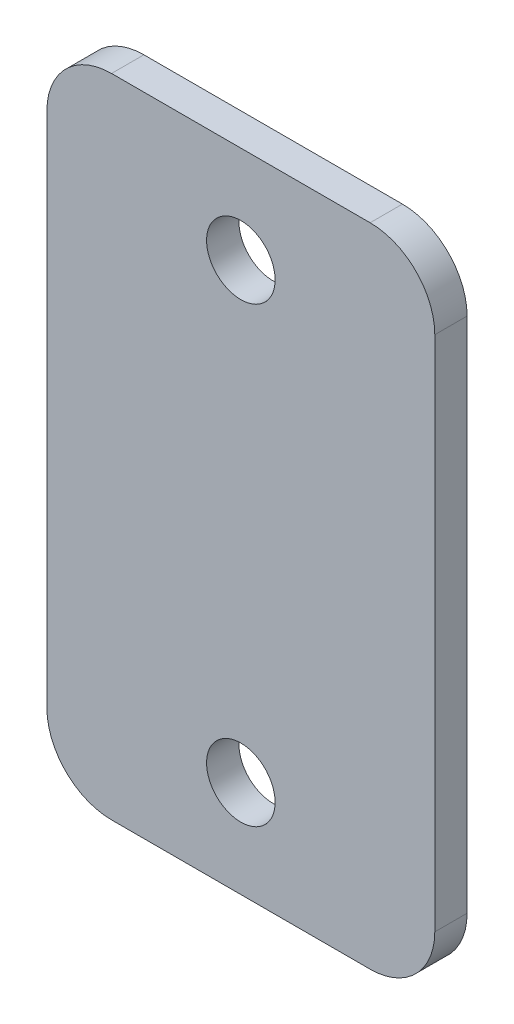
ISO-10303-21;
HEADER;
FILE_DESCRIPTION(('STEP AP214'),'2;1');
FILE_NAME('part.step','',(''),(''),'','','');
FILE_SCHEMA(('AUTOMOTIVE_DESIGN { 1 0 10303 214 1 1 1 1 }'));
ENDSEC;
DATA;
#1=APPLICATION_CONTEXT('core data for automotive mechanical design processes');
#2=APPLICATION_PROTOCOL_DEFINITION('international standard','automotive_design',2000,#1);
#3=PRODUCT_CONTEXT('',#1,'mechanical');
#4=PRODUCT('Part','Part','',(#3));
#5=PRODUCT_RELATED_PRODUCT_CATEGORY('part','',(#4));
#6=PRODUCT_DEFINITION_FORMATION('','',#4);
#7=PRODUCT_DEFINITION_CONTEXT('part definition',#1,'design');
#8=PRODUCT_DEFINITION('design','',#6,#7);
#9=PRODUCT_DEFINITION_SHAPE('','',#8);
#10=(LENGTH_UNIT() NAMED_UNIT(*) SI_UNIT(.MILLI.,.METRE.));
#11=(NAMED_UNIT(*) PLANE_ANGLE_UNIT() SI_UNIT($,.RADIAN.));
#12=(NAMED_UNIT(*) SI_UNIT($,.STERADIAN.) SOLID_ANGLE_UNIT());
#13=UNCERTAINTY_MEASURE_WITH_UNIT(LENGTH_MEASURE(1.E-05),#10,'distance_accuracy_value','');
#14=(GEOMETRIC_REPRESENTATION_CONTEXT(3) GLOBAL_UNCERTAINTY_ASSIGNED_CONTEXT((#13)) GLOBAL_UNIT_ASSIGNED_CONTEXT((#10,
#11,#12)) REPRESENTATION_CONTEXT('',''));
#15=CARTESIAN_POINT('',(0.,0.,0.));
#16=DIRECTION('',(0.,0.,1.));
#17=DIRECTION('',(1.,0.,0.));
#18=AXIS2_PLACEMENT_3D('',#15,#16,#17);
#19=CARTESIAN_POINT('',(0.,0.,0.));
#20=DIRECTION('',(0.,0.,1.));
#21=DIRECTION('',(1.,0.,0.));
#22=AXIS2_PLACEMENT_3D('',#19,#20,#21);
#23=PLANE('',#22);
#24=CARTESIAN_POINT('',(19.05,9.525,0.));
#25=DIRECTION('',(0.,0.,1.));
#26=DIRECTION('',(1.,0.,0.));
#27=AXIS2_PLACEMENT_3D('',#24,#25,#26);
#28=CIRCLE('',#27,3.3655);
#29=CARTESIAN_POINT('',(22.4155,9.525,0.));
#30=VERTEX_POINT('',#29);
#31=EDGE_CURVE('E133',#30,#30,#28,.T.);
#32=ORIENTED_EDGE('',*,*,#31,.T.);
#33=EDGE_LOOP('',(#32));
#34=FACE_BOUND('',#33,.T.);
#35=CARTESIAN_POINT('',(19.05,53.975,0.));
#36=DIRECTION('',(0.,0.,1.));
#37=DIRECTION('',(1.,0.,0.));
#38=AXIS2_PLACEMENT_3D('',#35,#36,#37);
#39=CIRCLE('',#38,3.3655);
#40=CARTESIAN_POINT('',(22.4155,53.975,0.));
#41=VERTEX_POINT('',#40);
#42=EDGE_CURVE('E136',#41,#41,#39,.T.);
#43=ORIENTED_EDGE('',*,*,#42,.T.);
#44=EDGE_LOOP('',(#43));
#45=FACE_BOUND('',#44,.T.);
#46=CARTESIAN_POINT('',(31.75,57.15,0.));
#47=DIRECTION('',(0.,0.,-1.));
#48=DIRECTION('',(-1.,0.,0.));
#49=AXIS2_PLACEMENT_3D('',#46,#47,#48);
#50=CIRCLE('',#49,6.35);
#51=CARTESIAN_POINT('',(38.1,57.15,0.));
#52=VERTEX_POINT('',#51);
#53=CARTESIAN_POINT('',(31.75,63.5,0.));
#54=VERTEX_POINT('',#53);
#55=EDGE_CURVE('E142',#52,#54,#50,.F.);
#56=ORIENTED_EDGE('',*,*,#55,.F.);
#57=DIRECTION('',(0.,1.,0.));
#58=VECTOR('',#57,1.);
#59=CARTESIAN_POINT('',(38.1,0.,0.));
#60=LINE('',#59,#58);
#61=CARTESIAN_POINT('',(38.1,6.35,0.));
#62=VERTEX_POINT('',#61);
#63=EDGE_CURVE('E113',#62,#52,#60,.T.);
#64=ORIENTED_EDGE('',*,*,#63,.F.);
#65=CARTESIAN_POINT('',(31.75,6.35,0.));
#66=DIRECTION('',(0.,0.,-1.));
#67=DIRECTION('',(-1.,0.,0.));
#68=AXIS2_PLACEMENT_3D('',#65,#66,#67);
#69=CIRCLE('',#68,6.35);
#70=CARTESIAN_POINT('',(31.75,0.,0.));
#71=VERTEX_POINT('',#70);
#72=EDGE_CURVE('E94',#71,#62,#69,.F.);
#73=ORIENTED_EDGE('',*,*,#72,.F.);
#74=DIRECTION('',(1.,0.,0.));
#75=VECTOR('',#74,1.);
#76=CARTESIAN_POINT('',(0.,0.,0.));
#77=LINE('',#76,#75);
#78=CARTESIAN_POINT('',(6.35,0.,0.));
#79=VERTEX_POINT('',#78);
#80=EDGE_CURVE('E91',#79,#71,#77,.T.);
#81=ORIENTED_EDGE('',*,*,#80,.F.);
#82=CARTESIAN_POINT('',(6.35,6.35,0.));
#83=DIRECTION('',(0.,0.,-1.));
#84=DIRECTION('',(-1.,0.,0.));
#85=AXIS2_PLACEMENT_3D('',#82,#83,#84);
#86=CIRCLE('',#85,6.35);
#87=CARTESIAN_POINT('',(0.,6.35,0.));
#88=VERTEX_POINT('',#87);
#89=EDGE_CURVE('E19',#88,#79,#86,.F.);
#90=ORIENTED_EDGE('',*,*,#89,.F.);
#91=DIRECTION('',(0.,1.,0.));
#92=VECTOR('',#91,1.);
#93=CARTESIAN_POINT('',(0.,63.5,0.));
#94=LINE('',#93,#92);
#95=CARTESIAN_POINT('',(0.,57.15,0.));
#96=VERTEX_POINT('',#95);
#97=EDGE_CURVE('E77',#96,#88,#94,.F.);
#98=ORIENTED_EDGE('',*,*,#97,.F.);
#99=CARTESIAN_POINT('',(6.35,57.15,0.));
#100=DIRECTION('',(0.,0.,-1.));
#101=DIRECTION('',(-1.,0.,0.));
#102=AXIS2_PLACEMENT_3D('',#99,#100,#101);
#103=CIRCLE('',#102,6.35);
#104=CARTESIAN_POINT('',(6.35,63.5,0.));
#105=VERTEX_POINT('',#104);
#106=EDGE_CURVE('E139',#105,#96,#103,.F.);
#107=ORIENTED_EDGE('',*,*,#106,.F.);
#108=DIRECTION('',(1.,0.,0.));
#109=VECTOR('',#108,1.);
#110=CARTESIAN_POINT('',(38.1,63.5,0.));
#111=LINE('',#110,#109);
#112=EDGE_CURVE('E108',#54,#105,#111,.F.);
#113=ORIENTED_EDGE('',*,*,#112,.F.);
#114=EDGE_LOOP('',(#56,#64,#73,#81,#90,#98,#107,#113));
#115=FACE_BOUND('',#114,.T.);
#116=ADVANCED_FACE('F16',(#34,#45,#115),#23,.F.);
#117=CARTESIAN_POINT('',(0.,63.5,0.));
#118=DIRECTION('',(-1.,0.,0.));
#119=DIRECTION('',(0.,0.,1.));
#120=AXIS2_PLACEMENT_3D('',#117,#118,#119);
#121=PLANE('',#120);
#122=DIRECTION('',(0.,1.,0.));
#123=VECTOR('',#122,1.);
#124=CARTESIAN_POINT('',(0.,0.,3.175));
#125=LINE('',#124,#123);
#126=CARTESIAN_POINT('',(0.,57.15,3.175));
#127=VERTEX_POINT('',#126);
#128=CARTESIAN_POINT('',(0.,6.35,3.175));
#129=VERTEX_POINT('',#128);
#130=EDGE_CURVE('E132',#127,#129,#125,.F.);
#131=ORIENTED_EDGE('',*,*,#130,.F.);
#132=DIRECTION('',(0.,0.,-1.));
#133=VECTOR('',#132,1.);
#134=CARTESIAN_POINT('',(0.,57.15,11.13155));
#135=LINE('',#134,#133);
#136=EDGE_CURVE('E110',#96,#127,#135,.F.);
#137=ORIENTED_EDGE('',*,*,#136,.F.);
#138=ORIENTED_EDGE('',*,*,#97,.T.);
#139=DIRECTION('',(0.,0.,-1.));
#140=VECTOR('',#139,1.);
#141=CARTESIAN_POINT('',(0.,6.35,11.13155));
#142=LINE('',#141,#140);
#143=EDGE_CURVE('E88',#129,#88,#142,.T.);
#144=ORIENTED_EDGE('',*,*,#143,.F.);
#145=EDGE_LOOP('',(#131,#137,#138,#144));
#146=FACE_BOUND('',#145,.T.);
#147=ADVANCED_FACE('F174',(#146),#121,.T.);
#148=CARTESIAN_POINT('',(6.35,6.35,11.13155));
#149=DIRECTION('',(0.,0.,-1.));
#150=DIRECTION('',(-1.,0.,0.));
#151=AXIS2_PLACEMENT_3D('',#148,#149,#150);
#152=CYLINDRICAL_SURFACE('',#151,6.35);
#153=ORIENTED_EDGE('',*,*,#143,.T.);
#154=ORIENTED_EDGE('',*,*,#89,.T.);
#155=DIRECTION('',(0.,0.,-1.));
#156=VECTOR('',#155,1.);
#157=CARTESIAN_POINT('',(6.35,0.,0.));
#158=LINE('',#157,#156);
#159=CARTESIAN_POINT('',(6.35,0.,3.175));
#160=VERTEX_POINT('',#159);
#161=EDGE_CURVE('E86',#160,#79,#158,.T.);
#162=ORIENTED_EDGE('',*,*,#161,.F.);
#163=CARTESIAN_POINT('',(6.35,6.35,3.175));
#164=DIRECTION('',(0.,0.,-1.));
#165=DIRECTION('',(-1.,0.,0.));
#166=AXIS2_PLACEMENT_3D('',#163,#164,#165);
#167=CIRCLE('',#166,6.35);
#168=EDGE_CURVE('E130',#129,#160,#167,.F.);
#169=ORIENTED_EDGE('',*,*,#168,.F.);
#170=EDGE_LOOP('',(#153,#154,#162,#169));
#171=FACE_BOUND('',#170,.T.);
#172=ADVANCED_FACE('F83',(#171),#152,.T.);
#173=CARTESIAN_POINT('',(0.,0.,0.));
#174=DIRECTION('',(0.,-1.,0.));
#175=DIRECTION('',(0.,0.,-1.));
#176=AXIS2_PLACEMENT_3D('',#173,#174,#175);
#177=PLANE('',#176);
#178=ORIENTED_EDGE('',*,*,#80,.T.);
#179=DIRECTION('',(0.,0.,-1.));
#180=VECTOR('',#179,1.);
#181=CARTESIAN_POINT('',(31.75,0.,11.13155));
#182=LINE('',#181,#180);
#183=CARTESIAN_POINT('',(31.75,0.,3.175));
#184=VERTEX_POINT('',#183);
#185=EDGE_CURVE('E97',#184,#71,#182,.T.);
#186=ORIENTED_EDGE('',*,*,#185,.F.);
#187=DIRECTION('',(1.,0.,0.));
#188=VECTOR('',#187,1.);
#189=CARTESIAN_POINT('',(0.,0.,3.175));
#190=LINE('',#189,#188);
#191=EDGE_CURVE('E101',#160,#184,#190,.T.);
#192=ORIENTED_EDGE('',*,*,#191,.F.);
#193=ORIENTED_EDGE('',*,*,#161,.T.);
#194=EDGE_LOOP('',(#178,#186,#192,#193));
#195=FACE_BOUND('',#194,.T.);
#196=ADVANCED_FACE('F99',(#195),#177,.T.);
#197=CARTESIAN_POINT('',(31.75,6.35,11.13155));
#198=DIRECTION('',(0.,0.,-1.));
#199=DIRECTION('',(-1.,0.,0.));
#200=AXIS2_PLACEMENT_3D('',#197,#198,#199);
#201=CYLINDRICAL_SURFACE('',#200,6.35);
#202=ORIENTED_EDGE('',*,*,#185,.T.);
#203=ORIENTED_EDGE('',*,*,#72,.T.);
#204=DIRECTION('',(0.,0.,-1.));
#205=VECTOR('',#204,1.);
#206=CARTESIAN_POINT('',(38.1,6.35,0.));
#207=LINE('',#206,#205);
#208=CARTESIAN_POINT('',(38.1,6.35,3.175));
#209=VERTEX_POINT('',#208);
#210=EDGE_CURVE('E115',#209,#62,#207,.T.);
#211=ORIENTED_EDGE('',*,*,#210,.F.);
#212=CARTESIAN_POINT('',(31.75,6.35,3.175));
#213=DIRECTION('',(0.,0.,-1.));
#214=DIRECTION('',(-1.,0.,0.));
#215=AXIS2_PLACEMENT_3D('',#212,#213,#214);
#216=CIRCLE('',#215,6.35);
#217=EDGE_CURVE('E127',#184,#209,#216,.F.);
#218=ORIENTED_EDGE('',*,*,#217,.F.);
#219=EDGE_LOOP('',(#202,#203,#211,#218));
#220=FACE_BOUND('',#219,.T.);
#221=ADVANCED_FACE('F146',(#220),#201,.T.);
#222=CARTESIAN_POINT('',(38.1,0.,0.));
#223=DIRECTION('',(1.,0.,0.));
#224=DIRECTION('',(0.,0.,-1.));
#225=AXIS2_PLACEMENT_3D('',#222,#223,#224);
#226=PLANE('',#225);
#227=ORIENTED_EDGE('',*,*,#63,.T.);
#228=DIRECTION('',(0.,0.,-1.));
#229=VECTOR('',#228,1.);
#230=CARTESIAN_POINT('',(38.1,57.15,11.13155));
#231=LINE('',#230,#229);
#232=CARTESIAN_POINT('',(38.1,57.15,3.175));
#233=VERTEX_POINT('',#232);
#234=EDGE_CURVE('E114',#233,#52,#231,.T.);
#235=ORIENTED_EDGE('',*,*,#234,.F.);
#236=DIRECTION('',(0.,1.,0.));
#237=VECTOR('',#236,1.);
#238=CARTESIAN_POINT('',(38.1,0.,3.175));
#239=LINE('',#238,#237);
#240=EDGE_CURVE('E126',#209,#233,#239,.T.);
#241=ORIENTED_EDGE('',*,*,#240,.F.);
#242=ORIENTED_EDGE('',*,*,#210,.T.);
#243=EDGE_LOOP('',(#227,#235,#241,#242));
#244=FACE_BOUND('',#243,.T.);
#245=ADVANCED_FACE('F169',(#244),#226,.T.);
#246=CARTESIAN_POINT('',(31.75,57.15,11.13155));
#247=DIRECTION('',(0.,0.,-1.));
#248=DIRECTION('',(-1.,0.,0.));
#249=AXIS2_PLACEMENT_3D('',#246,#247,#248);
#250=CYLINDRICAL_SURFACE('',#249,6.35);
#251=ORIENTED_EDGE('',*,*,#234,.T.);
#252=ORIENTED_EDGE('',*,*,#55,.T.);
#253=DIRECTION('',(0.,0.,1.));
#254=VECTOR('',#253,1.);
#255=CARTESIAN_POINT('',(31.75,63.5,0.));
#256=LINE('',#255,#254);
#257=CARTESIAN_POINT('',(31.75,63.5,3.175));
#258=VERTEX_POINT('',#257);
#259=EDGE_CURVE('E111',#258,#54,#256,.F.);
#260=ORIENTED_EDGE('',*,*,#259,.F.);
#261=CARTESIAN_POINT('',(31.75,57.15,3.175));
#262=DIRECTION('',(0.,0.,-1.));
#263=DIRECTION('',(-1.,0.,0.));
#264=AXIS2_PLACEMENT_3D('',#261,#262,#263);
#265=CIRCLE('',#264,6.35);
#266=EDGE_CURVE('E123',#233,#258,#265,.F.);
#267=ORIENTED_EDGE('',*,*,#266,.F.);
#268=EDGE_LOOP('',(#251,#252,#260,#267));
#269=FACE_BOUND('',#268,.T.);
#270=ADVANCED_FACE('F166',(#269),#250,.T.);
#271=CARTESIAN_POINT('',(38.1,63.5,0.));
#272=DIRECTION('',(0.,1.,0.));
#273=DIRECTION('',(0.,0.,1.));
#274=AXIS2_PLACEMENT_3D('',#271,#272,#273);
#275=PLANE('',#274);
#276=ORIENTED_EDGE('',*,*,#112,.T.);
#277=DIRECTION('',(0.,0.,-1.));
#278=VECTOR('',#277,1.);
#279=CARTESIAN_POINT('',(6.35,63.5,11.13155));
#280=LINE('',#279,#278);
#281=CARTESIAN_POINT('',(6.35,63.5,3.175));
#282=VERTEX_POINT('',#281);
#283=EDGE_CURVE('E34',#282,#105,#280,.T.);
#284=ORIENTED_EDGE('',*,*,#283,.F.);
#285=DIRECTION('',(1.,0.,0.));
#286=VECTOR('',#285,1.);
#287=CARTESIAN_POINT('',(0.,63.5,3.175));
#288=LINE('',#287,#286);
#289=EDGE_CURVE('E122',#258,#282,#288,.F.);
#290=ORIENTED_EDGE('',*,*,#289,.F.);
#291=ORIENTED_EDGE('',*,*,#259,.T.);
#292=EDGE_LOOP('',(#276,#284,#290,#291));
#293=FACE_BOUND('',#292,.T.);
#294=ADVANCED_FACE('F171',(#293),#275,.T.);
#295=CARTESIAN_POINT('',(6.35,57.15,11.13155));
#296=DIRECTION('',(0.,0.,-1.));
#297=DIRECTION('',(-1.,0.,0.));
#298=AXIS2_PLACEMENT_3D('',#295,#296,#297);
#299=CYLINDRICAL_SURFACE('',#298,6.35);
#300=ORIENTED_EDGE('',*,*,#283,.T.);
#301=ORIENTED_EDGE('',*,*,#106,.T.);
#302=ORIENTED_EDGE('',*,*,#136,.T.);
#303=CARTESIAN_POINT('',(6.35,57.15,3.175));
#304=DIRECTION('',(0.,0.,-1.));
#305=DIRECTION('',(-1.,0.,0.));
#306=AXIS2_PLACEMENT_3D('',#303,#304,#305);
#307=CIRCLE('',#306,6.35);
#308=EDGE_CURVE('E119',#282,#127,#307,.F.);
#309=ORIENTED_EDGE('',*,*,#308,.F.);
#310=EDGE_LOOP('',(#300,#301,#302,#309));
#311=FACE_BOUND('',#310,.T.);
#312=ADVANCED_FACE('F173',(#311),#299,.T.);
#313=CARTESIAN_POINT('',(19.05,53.975,0.));
#314=DIRECTION('',(0.,0.,1.));
#315=DIRECTION('',(1.,0.,0.));
#316=AXIS2_PLACEMENT_3D('',#313,#314,#315);
#317=CYLINDRICAL_SURFACE('',#316,3.3655);
#318=CARTESIAN_POINT('',(19.05,53.975,3.175));
#319=DIRECTION('',(0.,0.,1.));
#320=DIRECTION('',(1.,0.,0.));
#321=AXIS2_PLACEMENT_3D('',#318,#319,#320);
#322=CIRCLE('',#321,3.3655);
#323=CARTESIAN_POINT('',(22.4155,53.975,3.175));
#324=VERTEX_POINT('',#323);
#325=EDGE_CURVE('E25',#324,#324,#322,.F.);
#326=ORIENTED_EDGE('',*,*,#325,.F.);
#327=EDGE_LOOP('',(#326));
#328=FACE_BOUND('',#327,.T.);
#329=ORIENTED_EDGE('',*,*,#42,.F.);
#330=EDGE_LOOP('',(#329));
#331=FACE_BOUND('',#330,.T.);
#332=ADVANCED_FACE('F190',(#328,#331),#317,.F.);
#333=CARTESIAN_POINT('',(19.05,9.525,0.));
#334=DIRECTION('',(0.,0.,1.));
#335=DIRECTION('',(1.,0.,0.));
#336=AXIS2_PLACEMENT_3D('',#333,#334,#335);
#337=CYLINDRICAL_SURFACE('',#336,3.3655);
#338=CARTESIAN_POINT('',(19.05,9.525,3.175));
#339=DIRECTION('',(0.,0.,1.));
#340=DIRECTION('',(1.,0.,0.));
#341=AXIS2_PLACEMENT_3D('',#338,#339,#340);
#342=CIRCLE('',#341,3.3655);
#343=CARTESIAN_POINT('',(22.4155,9.525,3.175));
#344=VERTEX_POINT('',#343);
#345=EDGE_CURVE('E11',#344,#344,#342,.F.);
#346=ORIENTED_EDGE('',*,*,#345,.F.);
#347=EDGE_LOOP('',(#346));
#348=FACE_BOUND('',#347,.T.);
#349=ORIENTED_EDGE('',*,*,#31,.F.);
#350=EDGE_LOOP('',(#349));
#351=FACE_BOUND('',#350,.T.);
#352=ADVANCED_FACE('F184',(#348,#351),#337,.F.);
#353=CARTESIAN_POINT('',(0.,0.,3.175));
#354=DIRECTION('',(0.,0.,1.));
#355=DIRECTION('',(1.,0.,0.));
#356=AXIS2_PLACEMENT_3D('',#353,#354,#355);
#357=PLANE('',#356);
#358=ORIENTED_EDGE('',*,*,#345,.T.);
#359=EDGE_LOOP('',(#358));
#360=FACE_BOUND('',#359,.T.);
#361=ORIENTED_EDGE('',*,*,#325,.T.);
#362=EDGE_LOOP('',(#361));
#363=FACE_BOUND('',#362,.T.);
#364=ORIENTED_EDGE('',*,*,#289,.T.);
#365=ORIENTED_EDGE('',*,*,#308,.T.);
#366=ORIENTED_EDGE('',*,*,#130,.T.);
#367=ORIENTED_EDGE('',*,*,#168,.T.);
#368=ORIENTED_EDGE('',*,*,#191,.T.);
#369=ORIENTED_EDGE('',*,*,#217,.T.);
#370=ORIENTED_EDGE('',*,*,#240,.T.);
#371=ORIENTED_EDGE('',*,*,#266,.T.);
#372=EDGE_LOOP('',(#364,#365,#366,#367,#368,#369,#370,#371));
#373=FACE_BOUND('',#372,.T.);
#374=ADVANCED_FACE('F151',(#360,#363,#373),#357,.T.);
#375=CLOSED_SHELL('',(#116,#147,#172,#196,#221,#245,#270,#294,#312,#332,#352,#374));
#376=MANIFOLD_SOLID_BREP('B1',#375);
#377=ADVANCED_BREP_SHAPE_REPRESENTATION('',(#18,#376),#14);
#378=SHAPE_DEFINITION_REPRESENTATION(#9,#377);
ENDSEC;
END-ISO-10303-21;
